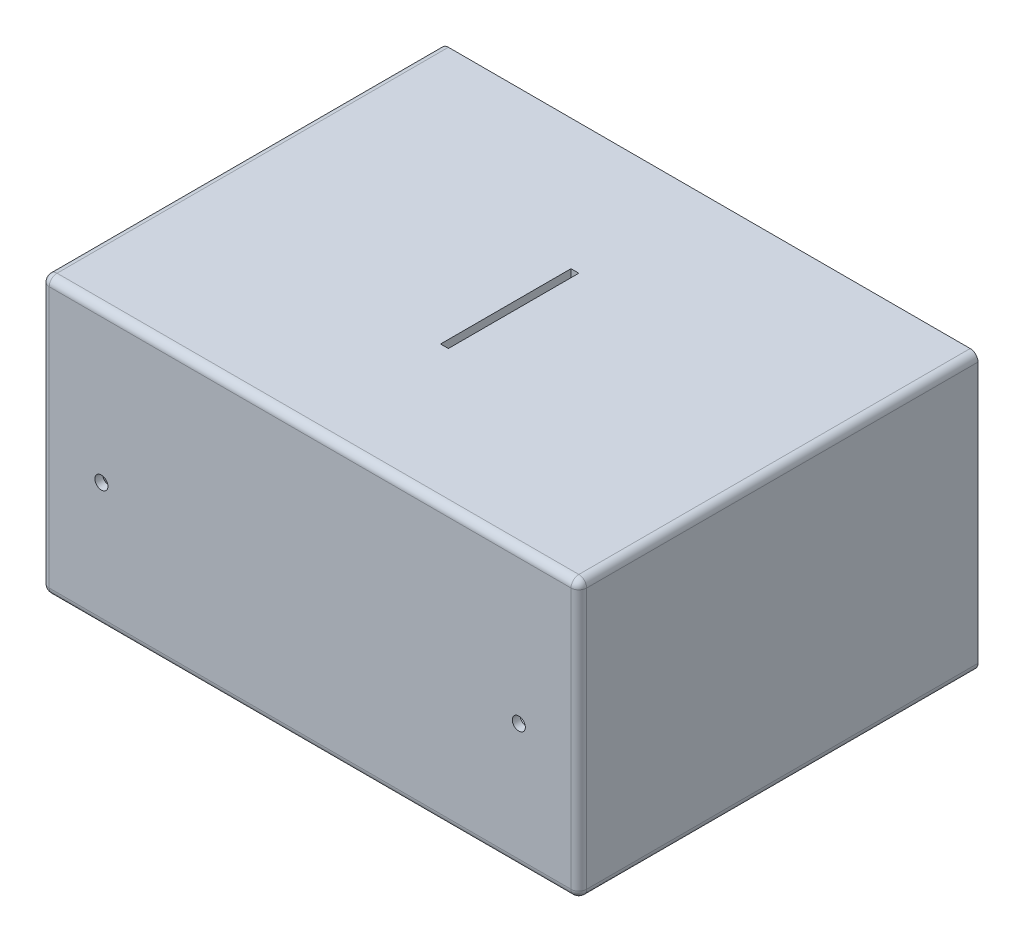
ISO-10303-21;
HEADER;
FILE_DESCRIPTION(('STEP AP214'),'2;1');
FILE_NAME('part.step','',(''),(''),'','','');
FILE_SCHEMA(('AUTOMOTIVE_DESIGN { 1 0 10303 214 1 1 1 1 }'));
ENDSEC;
DATA;
#1=APPLICATION_CONTEXT('core data for automotive mechanical design processes');
#2=APPLICATION_PROTOCOL_DEFINITION('international standard','automotive_design',2000,#1);
#3=PRODUCT_CONTEXT('',#1,'mechanical');
#4=PRODUCT('Part','Part','',(#3));
#5=PRODUCT_RELATED_PRODUCT_CATEGORY('part','',(#4));
#6=PRODUCT_DEFINITION_FORMATION('','',#4);
#7=PRODUCT_DEFINITION_CONTEXT('part definition',#1,'design');
#8=PRODUCT_DEFINITION('design','',#6,#7);
#9=PRODUCT_DEFINITION_SHAPE('','',#8);
#10=(LENGTH_UNIT() NAMED_UNIT(*) SI_UNIT(.MILLI.,.METRE.));
#11=(NAMED_UNIT(*) PLANE_ANGLE_UNIT() SI_UNIT($,.RADIAN.));
#12=(NAMED_UNIT(*) SI_UNIT($,.STERADIAN.) SOLID_ANGLE_UNIT());
#13=UNCERTAINTY_MEASURE_WITH_UNIT(LENGTH_MEASURE(1.E-05),#10,'distance_accuracy_value','');
#14=(GEOMETRIC_REPRESENTATION_CONTEXT(3) GLOBAL_UNCERTAINTY_ASSIGNED_CONTEXT((#13)) GLOBAL_UNIT_ASSIGNED_CONTEXT((#10,
#11,#12)) REPRESENTATION_CONTEXT('',''));
#15=CARTESIAN_POINT('',(0.,0.,0.));
#16=DIRECTION('',(0.,0.,1.));
#17=DIRECTION('',(1.,0.,0.));
#18=AXIS2_PLACEMENT_3D('',#15,#16,#17);
#19=CARTESIAN_POINT('',(100.,0.,78.));
#20=DIRECTION('',(0.,0.,-1.));
#21=DIRECTION('',(0.,-1.,0.));
#22=AXIS2_PLACEMENT_3D('',#19,#20,#21);
#23=PLANE('',#22);
#24=CARTESIAN_POINT('',(-80.,-55.,78.));
#25=DIRECTION('',(0.,0.,-1.));
#26=DIRECTION('',(1.,0.,0.));
#27=AXIS2_PLACEMENT_3D('',#24,#25,#26);
#28=CIRCLE('',#27,2.5);
#29=CARTESIAN_POINT('',(-77.5,-55.,78.));
#30=VERTEX_POINT('',#29);
#31=EDGE_CURVE('E211',#30,#30,#28,.T.);
#32=ORIENTED_EDGE('',*,*,#31,.T.);
#33=EDGE_LOOP('',(#32));
#34=FACE_BOUND('',#33,.T.);
#35=CARTESIAN_POINT('',(80.,-55.,78.));
#36=DIRECTION('',(0.,0.,-1.));
#37=DIRECTION('',(1.,0.,0.));
#38=AXIS2_PLACEMENT_3D('',#35,#36,#37);
#39=CIRCLE('',#38,2.5);
#40=CARTESIAN_POINT('',(82.5,-55.,78.));
#41=VERTEX_POINT('',#40);
#42=EDGE_CURVE('E252',#41,#41,#39,.T.);
#43=ORIENTED_EDGE('',*,*,#42,.T.);
#44=EDGE_LOOP('',(#43));
#45=FACE_BOUND('',#44,.T.);
#46=DIRECTION('',(-1.,0.,0.));
#47=VECTOR('',#46,1.);
#48=CARTESIAN_POINT('',(100.,0.,78.));
#49=LINE('',#48,#47);
#50=CARTESIAN_POINT('',(100.,0.,78.));
#51=VERTEX_POINT('',#50);
#52=CARTESIAN_POINT('',(-100.,0.,78.));
#53=VERTEX_POINT('',#52);
#54=EDGE_CURVE('E284',#51,#53,#49,.T.);
#55=ORIENTED_EDGE('',*,*,#54,.T.);
#56=DIRECTION('',(0.,-1.,0.));
#57=VECTOR('',#56,1.);
#58=CARTESIAN_POINT('',(-100.,0.,78.));
#59=LINE('',#58,#57);
#60=CARTESIAN_POINT('',(-100.,-100.,78.));
#61=VERTEX_POINT('',#60);
#62=EDGE_CURVE('E44',#53,#61,#59,.T.);
#63=ORIENTED_EDGE('',*,*,#62,.T.);
#64=DIRECTION('',(-1.,0.,0.));
#65=VECTOR('',#64,1.);
#66=CARTESIAN_POINT('',(100.,-100.,78.));
#67=LINE('',#66,#65);
#68=CARTESIAN_POINT('',(100.,-100.,78.));
#69=VERTEX_POINT('',#68);
#70=EDGE_CURVE('E10',#69,#61,#67,.T.);
#71=ORIENTED_EDGE('',*,*,#70,.F.);
#72=DIRECTION('',(0.,-1.,0.));
#73=VECTOR('',#72,1.);
#74=CARTESIAN_POINT('',(100.,0.,78.));
#75=LINE('',#74,#73);
#76=EDGE_CURVE('E280',#51,#69,#75,.T.);
#77=ORIENTED_EDGE('',*,*,#76,.F.);
#78=EDGE_LOOP('',(#55,#63,#71,#77));
#79=FACE_BOUND('',#78,.T.);
#80=ADVANCED_FACE('F16',(#34,#45,#79),#23,.F.);
#81=CARTESIAN_POINT('',(100.,-100.,75.));
#82=DIRECTION('',(-1.,0.,0.));
#83=DIRECTION('',(0.,1.,0.));
#84=AXIS2_PLACEMENT_3D('',#81,#82,#83);
#85=CYLINDRICAL_SURFACE('',#84,3.);
#86=CARTESIAN_POINT('',(-100.,-100.,75.));
#87=DIRECTION('',(1.,0.,0.));
#88=DIRECTION('',(0.,1.,0.));
#89=AXIS2_PLACEMENT_3D('',#86,#87,#88);
#90=CIRCLE('',#89,3.);
#91=CARTESIAN_POINT('',(-100.,-103.,75.));
#92=VERTEX_POINT('',#91);
#93=EDGE_CURVE('E24',#61,#92,#90,.T.);
#94=ORIENTED_EDGE('',*,*,#93,.T.);
#95=DIRECTION('',(-1.,0.,0.));
#96=VECTOR('',#95,1.);
#97=CARTESIAN_POINT('',(100.,-103.,75.));
#98=LINE('',#97,#96);
#99=CARTESIAN_POINT('',(100.,-103.,75.));
#100=VERTEX_POINT('',#99);
#101=EDGE_CURVE('E253',#100,#92,#98,.T.);
#102=ORIENTED_EDGE('',*,*,#101,.F.);
#103=CARTESIAN_POINT('',(100.,-100.,75.));
#104=DIRECTION('',(1.,0.,0.));
#105=DIRECTION('',(0.,1.,0.));
#106=AXIS2_PLACEMENT_3D('',#103,#104,#105);
#107=CIRCLE('',#106,3.);
#108=EDGE_CURVE('E273',#69,#100,#107,.T.);
#109=ORIENTED_EDGE('',*,*,#108,.F.);
#110=ORIENTED_EDGE('',*,*,#70,.T.);
#111=EDGE_LOOP('',(#94,#102,#109,#110));
#112=FACE_BOUND('',#111,.T.);
#113=ADVANCED_FACE('F500',(#112),#85,.T.);
#114=CARTESIAN_POINT('',(-100.,-100.,75.));
#115=DIRECTION('',(-0.707106781186548,0.707106781186548,0.));
#116=DIRECTION('',(0.577350269189626,0.577350269189626,-0.577350269189626));
#117=AXIS2_PLACEMENT_3D('',#114,#115,#116);
#118=SPHERICAL_SURFACE('',#117,3.);
#119=CARTESIAN_POINT('',(-100.,-100.,75.));
#120=DIRECTION('',(0.,-1.,0.));
#121=DIRECTION('',(1.,0.,0.));
#122=AXIS2_PLACEMENT_3D('',#119,#120,#121);
#123=CIRCLE('',#122,3.);
#124=CARTESIAN_POINT('',(-103.,-100.,75.));
#125=VERTEX_POINT('',#124);
#126=EDGE_CURVE('E293',#61,#125,#123,.T.);
#127=ORIENTED_EDGE('',*,*,#126,.T.);
#128=CARTESIAN_POINT('',(-100.,-100.,75.));
#129=DIRECTION('',(0.,0.,1.));
#130=DIRECTION('',(0.,1.,0.));
#131=AXIS2_PLACEMENT_3D('',#128,#129,#130);
#132=CIRCLE('',#131,3.);
#133=EDGE_CURVE('E248',#125,#92,#132,.T.);
#134=ORIENTED_EDGE('',*,*,#133,.T.);
#135=ORIENTED_EDGE('',*,*,#93,.F.);
#136=EDGE_LOOP('',(#127,#134,#135));
#137=FACE_BOUND('',#136,.T.);
#138=ADVANCED_FACE('F502',(#137),#118,.T.);
#139=CARTESIAN_POINT('',(-100.,0.,75.));
#140=DIRECTION('',(0.,-1.,0.));
#141=DIRECTION('',(1.,0.,0.));
#142=AXIS2_PLACEMENT_3D('',#139,#140,#141);
#143=CYLINDRICAL_SURFACE('',#142,3.);
#144=ORIENTED_EDGE('',*,*,#62,.F.);
#145=CARTESIAN_POINT('',(-100.,0.,75.));
#146=DIRECTION('',(0.,-1.,0.));
#147=DIRECTION('',(1.,0.,0.));
#148=AXIS2_PLACEMENT_3D('',#145,#146,#147);
#149=CIRCLE('',#148,3.);
#150=CARTESIAN_POINT('',(-103.,0.,75.));
#151=VERTEX_POINT('',#150);
#152=EDGE_CURVE('E291',#53,#151,#149,.T.);
#153=ORIENTED_EDGE('',*,*,#152,.T.);
#154=DIRECTION('',(0.,-1.,0.));
#155=VECTOR('',#154,1.);
#156=CARTESIAN_POINT('',(-103.,0.,75.));
#157=LINE('',#156,#155);
#158=EDGE_CURVE('E241',#151,#125,#157,.T.);
#159=ORIENTED_EDGE('',*,*,#158,.T.);
#160=ORIENTED_EDGE('',*,*,#126,.F.);
#161=EDGE_LOOP('',(#144,#153,#159,#160));
#162=FACE_BOUND('',#161,.T.);
#163=ADVANCED_FACE('F503',(#162),#143,.T.);
#164=CARTESIAN_POINT('',(-100.,0.,75.));
#165=DIRECTION('',(0.707106781186548,0.707106781186548,0.));
#166=DIRECTION('',(0.577350269189626,-0.577350269189626,-0.577350269189626));
#167=AXIS2_PLACEMENT_3D('',#164,#165,#166);
#168=SPHERICAL_SURFACE('',#167,3.);
#169=ORIENTED_EDGE('',*,*,#152,.F.);
#170=CARTESIAN_POINT('',(-100.,0.,75.));
#171=DIRECTION('',(-1.,0.,0.));
#172=DIRECTION('',(0.,-1.,0.));
#173=AXIS2_PLACEMENT_3D('',#170,#171,#172);
#174=CIRCLE('',#173,3.);
#175=CARTESIAN_POINT('',(-100.,3.,75.));
#176=VERTEX_POINT('',#175);
#177=EDGE_CURVE('E288',#53,#176,#174,.T.);
#178=ORIENTED_EDGE('',*,*,#177,.T.);
#179=CARTESIAN_POINT('',(-100.,0.,75.));
#180=DIRECTION('',(0.,0.,-1.));
#181=DIRECTION('',(0.,-1.,0.));
#182=AXIS2_PLACEMENT_3D('',#179,#180,#181);
#183=CIRCLE('',#182,3.);
#184=EDGE_CURVE('E235',#151,#176,#183,.T.);
#185=ORIENTED_EDGE('',*,*,#184,.F.);
#186=EDGE_LOOP('',(#169,#178,#185));
#187=FACE_BOUND('',#186,.T.);
#188=ADVANCED_FACE('F439',(#187),#168,.T.);
#189=CARTESIAN_POINT('',(100.,0.,75.));
#190=DIRECTION('',(-1.,0.,0.));
#191=DIRECTION('',(0.,-1.,0.));
#192=AXIS2_PLACEMENT_3D('',#189,#190,#191);
#193=CYLINDRICAL_SURFACE('',#192,3.);
#194=ORIENTED_EDGE('',*,*,#54,.F.);
#195=CARTESIAN_POINT('',(100.,0.,75.));
#196=DIRECTION('',(-1.,0.,0.));
#197=DIRECTION('',(0.,-1.,0.));
#198=AXIS2_PLACEMENT_3D('',#195,#196,#197);
#199=CIRCLE('',#198,3.);
#200=CARTESIAN_POINT('',(100.,3.,75.));
#201=VERTEX_POINT('',#200);
#202=EDGE_CURVE('E281',#51,#201,#199,.T.);
#203=ORIENTED_EDGE('',*,*,#202,.T.);
#204=DIRECTION('',(-1.,0.,0.));
#205=VECTOR('',#204,1.);
#206=CARTESIAN_POINT('',(100.,3.,75.));
#207=LINE('',#206,#205);
#208=EDGE_CURVE('E402',#201,#176,#207,.T.);
#209=ORIENTED_EDGE('',*,*,#208,.T.);
#210=ORIENTED_EDGE('',*,*,#177,.F.);
#211=EDGE_LOOP('',(#194,#203,#209,#210));
#212=FACE_BOUND('',#211,.T.);
#213=ADVANCED_FACE('F429',(#212),#193,.T.);
#214=CARTESIAN_POINT('',(100.,0.,75.));
#215=DIRECTION('',(0.,0.707106781186548,-0.707106781186548));
#216=DIRECTION('',(-0.577350269189626,-0.577350269189626,-0.577350269189626));
#217=AXIS2_PLACEMENT_3D('',#214,#215,#216);
#218=SPHERICAL_SURFACE('',#217,3.);
#219=CARTESIAN_POINT('',(100.,0.,75.));
#220=DIRECTION('',(0.,-1.,0.));
#221=DIRECTION('',(0.,0.,-1.));
#222=AXIS2_PLACEMENT_3D('',#219,#220,#221);
#223=CIRCLE('',#222,3.);
#224=CARTESIAN_POINT('',(103.,0.,75.));
#225=VERTEX_POINT('',#224);
#226=EDGE_CURVE('E276',#225,#51,#223,.T.);
#227=ORIENTED_EDGE('',*,*,#226,.F.);
#228=CARTESIAN_POINT('',(100.,0.,75.));
#229=DIRECTION('',(0.,0.,1.));
#230=DIRECTION('',(0.,-1.,0.));
#231=AXIS2_PLACEMENT_3D('',#228,#229,#230);
#232=CIRCLE('',#231,3.);
#233=EDGE_CURVE('E414',#225,#201,#232,.T.);
#234=ORIENTED_EDGE('',*,*,#233,.T.);
#235=ORIENTED_EDGE('',*,*,#202,.F.);
#236=EDGE_LOOP('',(#227,#234,#235));
#237=FACE_BOUND('',#236,.T.);
#238=ADVANCED_FACE('F508',(#237),#218,.T.);
#239=CARTESIAN_POINT('',(100.,0.,75.));
#240=DIRECTION('',(0.,-1.,0.));
#241=DIRECTION('',(0.,0.,-1.));
#242=AXIS2_PLACEMENT_3D('',#239,#240,#241);
#243=CYLINDRICAL_SURFACE('',#242,3.);
#244=DIRECTION('',(0.,-1.,0.));
#245=VECTOR('',#244,1.);
#246=CARTESIAN_POINT('',(103.,0.,75.));
#247=LINE('',#246,#245);
#248=CARTESIAN_POINT('',(103.,-100.,75.));
#249=VERTEX_POINT('',#248);
#250=EDGE_CURVE('E317',#225,#249,#247,.T.);
#251=ORIENTED_EDGE('',*,*,#250,.F.);
#252=ORIENTED_EDGE('',*,*,#226,.T.);
#253=ORIENTED_EDGE('',*,*,#76,.T.);
#254=CARTESIAN_POINT('',(100.,-100.,75.));
#255=DIRECTION('',(0.,-1.,0.));
#256=DIRECTION('',(0.,0.,-1.));
#257=AXIS2_PLACEMENT_3D('',#254,#255,#256);
#258=CIRCLE('',#257,3.);
#259=EDGE_CURVE('E272',#249,#69,#258,.T.);
#260=ORIENTED_EDGE('',*,*,#259,.F.);
#261=EDGE_LOOP('',(#251,#252,#253,#260));
#262=FACE_BOUND('',#261,.T.);
#263=ADVANCED_FACE('F714',(#262),#243,.T.);
#264=CARTESIAN_POINT('',(100.,-100.,75.));
#265=DIRECTION('',(0.,0.707106781186548,0.707106781186548));
#266=DIRECTION('',(-0.577350269189626,0.577350269189626,-0.577350269189626));
#267=AXIS2_PLACEMENT_3D('',#264,#265,#266);
#268=SPHERICAL_SURFACE('',#267,3.);
#269=ORIENTED_EDGE('',*,*,#259,.T.);
#270=ORIENTED_EDGE('',*,*,#108,.T.);
#271=CARTESIAN_POINT('',(100.,-100.,75.));
#272=DIRECTION('',(0.,0.,-1.));
#273=DIRECTION('',(0.,1.,0.));
#274=AXIS2_PLACEMENT_3D('',#271,#272,#273);
#275=CIRCLE('',#274,3.);
#276=EDGE_CURVE('E354',#249,#100,#275,.T.);
#277=ORIENTED_EDGE('',*,*,#276,.F.);
#278=EDGE_LOOP('',(#269,#270,#277));
#279=FACE_BOUND('',#278,.T.);
#280=ADVANCED_FACE('F499',(#279),#268,.T.);
#281=CARTESIAN_POINT('',(-3.,0.,0.));
#282=DIRECTION('',(1.,0.,0.));
#283=DIRECTION('',(0.,1.,0.));
#284=AXIS2_PLACEMENT_3D('',#281,#282,#283);
#285=PLANE('',#284);
#286=DIRECTION('',(0.,0.,1.));
#287=VECTOR('',#286,1.);
#288=CARTESIAN_POINT('',(-3.,0.,0.));
#289=LINE('',#288,#287);
#290=CARTESIAN_POINT('',(-3.,0.,-25.));
#291=VERTEX_POINT('',#290);
#292=CARTESIAN_POINT('',(-3.,0.,25.));
#293=VERTEX_POINT('',#292);
#294=EDGE_CURVE('E205',#291,#293,#289,.T.);
#295=ORIENTED_EDGE('',*,*,#294,.F.);
#296=DIRECTION('',(0.,1.,0.));
#297=VECTOR('',#296,1.);
#298=CARTESIAN_POINT('',(-3.,-40.,-25.));
#299=LINE('',#298,#297);
#300=CARTESIAN_POINT('',(-3.,3.,-25.));
#301=VERTEX_POINT('',#300);
#302=EDGE_CURVE('E198',#291,#301,#299,.T.);
#303=ORIENTED_EDGE('',*,*,#302,.T.);
#304=DIRECTION('',(0.,0.,1.));
#305=VECTOR('',#304,1.);
#306=CARTESIAN_POINT('',(-3.,3.,0.));
#307=LINE('',#306,#305);
#308=CARTESIAN_POINT('',(-3.,3.,25.));
#309=VERTEX_POINT('',#308);
#310=EDGE_CURVE('E202',#301,#309,#307,.T.);
#311=ORIENTED_EDGE('',*,*,#310,.T.);
#312=DIRECTION('',(0.,-1.,0.));
#313=VECTOR('',#312,1.);
#314=CARTESIAN_POINT('',(-3.,40.,25.));
#315=LINE('',#314,#313);
#316=EDGE_CURVE('E269',#309,#293,#315,.T.);
#317=ORIENTED_EDGE('',*,*,#316,.T.);
#318=EDGE_LOOP('',(#295,#303,#311,#317));
#319=FACE_BOUND('',#318,.T.);
#320=ADVANCED_FACE('F200',(#319),#285,.T.);
#321=CARTESIAN_POINT('',(0.,40.,25.));
#322=DIRECTION('',(0.,0.,1.));
#323=DIRECTION('',(1.,0.,0.));
#324=AXIS2_PLACEMENT_3D('',#321,#322,#323);
#325=PLANE('',#324);
#326=DIRECTION('',(-1.,0.,0.));
#327=VECTOR('',#326,1.);
#328=CARTESIAN_POINT('',(0.,0.,25.));
#329=LINE('',#328,#327);
#330=CARTESIAN_POINT('',(0.,0.,25.));
#331=VERTEX_POINT('',#330);
#332=EDGE_CURVE('E390',#331,#293,#329,.T.);
#333=ORIENTED_EDGE('',*,*,#332,.T.);
#334=ORIENTED_EDGE('',*,*,#316,.F.);
#335=DIRECTION('',(-1.,0.,0.));
#336=VECTOR('',#335,1.);
#337=CARTESIAN_POINT('',(0.,3.,25.));
#338=LINE('',#337,#336);
#339=CARTESIAN_POINT('',(0.,3.,25.));
#340=VERTEX_POINT('',#339);
#341=EDGE_CURVE('E225',#340,#309,#338,.T.);
#342=ORIENTED_EDGE('',*,*,#341,.F.);
#343=DIRECTION('',(0.,-1.,0.));
#344=VECTOR('',#343,1.);
#345=CARTESIAN_POINT('',(0.,40.,25.));
#346=LINE('',#345,#344);
#347=EDGE_CURVE('E266',#340,#331,#346,.T.);
#348=ORIENTED_EDGE('',*,*,#347,.T.);
#349=EDGE_LOOP('',(#333,#334,#342,#348));
#350=FACE_BOUND('',#349,.T.);
#351=ADVANCED_FACE('F688',(#350),#325,.F.);
#352=CARTESIAN_POINT('',(0.,0.,0.));
#353=DIRECTION('',(1.,0.,0.));
#354=DIRECTION('',(0.,1.,0.));
#355=AXIS2_PLACEMENT_3D('',#352,#353,#354);
#356=PLANE('',#355);
#357=ORIENTED_EDGE('',*,*,#347,.F.);
#358=DIRECTION('',(0.,0.,1.));
#359=VECTOR('',#358,1.);
#360=CARTESIAN_POINT('',(0.,3.,0.));
#361=LINE('',#360,#359);
#362=CARTESIAN_POINT('',(0.,3.,-25.));
#363=VERTEX_POINT('',#362);
#364=EDGE_CURVE('E231',#363,#340,#361,.T.);
#365=ORIENTED_EDGE('',*,*,#364,.F.);
#366=DIRECTION('',(0.,1.,0.));
#367=VECTOR('',#366,1.);
#368=CARTESIAN_POINT('',(0.,-40.,-25.));
#369=LINE('',#368,#367);
#370=CARTESIAN_POINT('',(0.,0.,-25.));
#371=VERTEX_POINT('',#370);
#372=EDGE_CURVE('E210',#371,#363,#369,.T.);
#373=ORIENTED_EDGE('',*,*,#372,.F.);
#374=DIRECTION('',(0.,0.,1.));
#375=VECTOR('',#374,1.);
#376=CARTESIAN_POINT('',(0.,0.,0.));
#377=LINE('',#376,#375);
#378=EDGE_CURVE('E394',#371,#331,#377,.T.);
#379=ORIENTED_EDGE('',*,*,#378,.T.);
#380=EDGE_LOOP('',(#357,#365,#373,#379));
#381=FACE_BOUND('',#380,.T.);
#382=ADVANCED_FACE('F679',(#381),#356,.F.);
#383=CARTESIAN_POINT('',(0.,-40.,-25.));
#384=DIRECTION('',(0.,0.,-1.));
#385=DIRECTION('',(0.,-1.,0.));
#386=AXIS2_PLACEMENT_3D('',#383,#384,#385);
#387=PLANE('',#386);
#388=DIRECTION('',(1.,0.,0.));
#389=VECTOR('',#388,1.);
#390=CARTESIAN_POINT('',(0.,3.,-25.));
#391=LINE('',#390,#389);
#392=EDGE_CURVE('E214',#301,#363,#391,.T.);
#393=ORIENTED_EDGE('',*,*,#392,.F.);
#394=ORIENTED_EDGE('',*,*,#302,.F.);
#395=DIRECTION('',(1.,0.,0.));
#396=VECTOR('',#395,1.);
#397=CARTESIAN_POINT('',(0.,0.,-25.));
#398=LINE('',#397,#396);
#399=EDGE_CURVE('E385',#291,#371,#398,.T.);
#400=ORIENTED_EDGE('',*,*,#399,.T.);
#401=ORIENTED_EDGE('',*,*,#372,.T.);
#402=EDGE_LOOP('',(#393,#394,#400,#401));
#403=FACE_BOUND('',#402,.T.);
#404=ADVANCED_FACE('F215',(#403),#387,.F.);
#405=CARTESIAN_POINT('',(-80.,-55.,0.));
#406=DIRECTION('',(0.,0.,-1.));
#407=DIRECTION('',(1.,0.,0.));
#408=AXIS2_PLACEMENT_3D('',#405,#406,#407);
#409=CYLINDRICAL_SURFACE('',#408,2.5);
#410=CARTESIAN_POINT('',(-80.,-55.,75.));
#411=DIRECTION('',(0.,0.,-1.));
#412=DIRECTION('',(1.,0.,0.));
#413=AXIS2_PLACEMENT_3D('',#410,#411,#412);
#414=CIRCLE('',#413,2.5);
#415=CARTESIAN_POINT('',(-77.5,-55.,75.));
#416=VERTEX_POINT('',#415);
#417=EDGE_CURVE('E319',#416,#416,#414,.T.);
#418=ORIENTED_EDGE('',*,*,#417,.T.);
#419=DIRECTION('',(0.,0.,1.));
#420=VECTOR('',#419,1.);
#421=CARTESIAN_POINT('',(-77.5,-55.,0.));
#422=LINE('',#421,#420);
#423=EDGE_CURVE('E244',#416,#30,#422,.T.);
#424=ORIENTED_EDGE('',*,*,#423,.T.);
#425=ORIENTED_EDGE('',*,*,#31,.F.);
#426=ORIENTED_EDGE('',*,*,#423,.F.);
#427=EDGE_LOOP('',(#418,#424,#425,#426));
#428=FACE_BOUND('',#427,.T.);
#429=ADVANCED_FACE('F560',(#428),#409,.F.);
#430=CARTESIAN_POINT('',(80.,-55.,0.));
#431=DIRECTION('',(0.,0.,-1.));
#432=DIRECTION('',(1.,0.,0.));
#433=AXIS2_PLACEMENT_3D('',#430,#431,#432);
#434=CYLINDRICAL_SURFACE('',#433,2.5);
#435=CARTESIAN_POINT('',(80.,-55.,75.));
#436=DIRECTION('',(0.,0.,-1.));
#437=DIRECTION('',(1.,0.,0.));
#438=AXIS2_PLACEMENT_3D('',#435,#436,#437);
#439=CIRCLE('',#438,2.5);
#440=CARTESIAN_POINT('',(82.5,-55.,75.));
#441=VERTEX_POINT('',#440);
#442=EDGE_CURVE('E324',#441,#441,#439,.T.);
#443=ORIENTED_EDGE('',*,*,#442,.T.);
#444=DIRECTION('',(0.,0.,1.));
#445=VECTOR('',#444,1.);
#446=CARTESIAN_POINT('',(82.5,-55.,0.));
#447=LINE('',#446,#445);
#448=EDGE_CURVE('E257',#441,#41,#447,.T.);
#449=ORIENTED_EDGE('',*,*,#448,.T.);
#450=ORIENTED_EDGE('',*,*,#42,.F.);
#451=ORIENTED_EDGE('',*,*,#448,.F.);
#452=EDGE_LOOP('',(#443,#449,#450,#451));
#453=FACE_BOUND('',#452,.T.);
#454=ADVANCED_FACE('F535',(#453),#434,.F.);
#455=CARTESIAN_POINT('',(0.,-103.,0.));
#456=DIRECTION('',(0.,-1.,0.));
#457=DIRECTION('',(0.,0.,-1.));
#458=AXIS2_PLACEMENT_3D('',#455,#456,#457);
#459=PLANE('',#458);
#460=DIRECTION('',(1.,0.,0.));
#461=VECTOR('',#460,1.);
#462=CARTESIAN_POINT('',(-100.,-103.,-75.));
#463=LINE('',#462,#461);
#464=CARTESIAN_POINT('',(-100.,-103.,-75.));
#465=VERTEX_POINT('',#464);
#466=CARTESIAN_POINT('',(100.,-103.,-75.));
#467=VERTEX_POINT('',#466);
#468=EDGE_CURVE('E307',#465,#467,#463,.T.);
#469=ORIENTED_EDGE('',*,*,#468,.T.);
#470=DIRECTION('',(0.,0.,1.));
#471=VECTOR('',#470,1.);
#472=CARTESIAN_POINT('',(100.,-103.,-75.));
#473=LINE('',#472,#471);
#474=EDGE_CURVE('E318',#467,#100,#473,.T.);
#475=ORIENTED_EDGE('',*,*,#474,.T.);
#476=ORIENTED_EDGE('',*,*,#101,.T.);
#477=DIRECTION('',(0.,0.,-1.));
#478=VECTOR('',#477,1.);
#479=CARTESIAN_POINT('',(-100.,-103.,75.));
#480=LINE('',#479,#478);
#481=EDGE_CURVE('E258',#92,#465,#480,.T.);
#482=ORIENTED_EDGE('',*,*,#481,.T.);
#483=EDGE_LOOP('',(#469,#475,#476,#482));
#484=FACE_BOUND('',#483,.T.);
#485=ADVANCED_FACE('F490',(#484),#459,.T.);
#486=CARTESIAN_POINT('',(-100.,-100.,75.));
#487=DIRECTION('',(0.,0.,-1.));
#488=DIRECTION('',(0.,1.,0.));
#489=AXIS2_PLACEMENT_3D('',#486,#487,#488);
#490=CYLINDRICAL_SURFACE('',#489,3.);
#491=ORIENTED_EDGE('',*,*,#133,.F.);
#492=DIRECTION('',(0.,0.,-1.));
#493=VECTOR('',#492,1.);
#494=CARTESIAN_POINT('',(-103.,-100.,75.));
#495=LINE('',#494,#493);
#496=CARTESIAN_POINT('',(-103.,-100.,-75.));
#497=VERTEX_POINT('',#496);
#498=EDGE_CURVE('E238',#125,#497,#495,.T.);
#499=ORIENTED_EDGE('',*,*,#498,.T.);
#500=CARTESIAN_POINT('',(-100.,-100.,-75.));
#501=DIRECTION('',(0.,0.,1.));
#502=DIRECTION('',(0.,1.,0.));
#503=AXIS2_PLACEMENT_3D('',#500,#501,#502);
#504=CIRCLE('',#503,3.);
#505=EDGE_CURVE('E330',#497,#465,#504,.T.);
#506=ORIENTED_EDGE('',*,*,#505,.T.);
#507=ORIENTED_EDGE('',*,*,#481,.F.);
#508=EDGE_LOOP('',(#491,#499,#506,#507));
#509=FACE_BOUND('',#508,.T.);
#510=ADVANCED_FACE('F501',(#509),#490,.T.);
#511=CARTESIAN_POINT('',(-103.,0.,75.));
#512=DIRECTION('',(1.,0.,0.));
#513=DIRECTION('',(0.,1.,0.));
#514=AXIS2_PLACEMENT_3D('',#511,#512,#513);
#515=PLANE('',#514);
#516=DIRECTION('',(0.,0.,-1.));
#517=VECTOR('',#516,1.);
#518=CARTESIAN_POINT('',(-103.,0.,75.));
#519=LINE('',#518,#517);
#520=CARTESIAN_POINT('',(-103.,0.,-75.));
#521=VERTEX_POINT('',#520);
#522=EDGE_CURVE('E220',#151,#521,#519,.T.);
#523=ORIENTED_EDGE('',*,*,#522,.T.);
#524=DIRECTION('',(0.,-1.,0.));
#525=VECTOR('',#524,1.);
#526=CARTESIAN_POINT('',(-103.,0.,-75.));
#527=LINE('',#526,#525);
#528=EDGE_CURVE('E325',#521,#497,#527,.T.);
#529=ORIENTED_EDGE('',*,*,#528,.T.);
#530=ORIENTED_EDGE('',*,*,#498,.F.);
#531=ORIENTED_EDGE('',*,*,#158,.F.);
#532=EDGE_LOOP('',(#523,#529,#530,#531));
#533=FACE_BOUND('',#532,.T.);
#534=ADVANCED_FACE('F514',(#533),#515,.F.);
#535=CARTESIAN_POINT('',(-100.,0.,75.));
#536=DIRECTION('',(0.,0.,-1.));
#537=DIRECTION('',(0.,-1.,0.));
#538=AXIS2_PLACEMENT_3D('',#535,#536,#537);
#539=CYLINDRICAL_SURFACE('',#538,3.);
#540=DIRECTION('',(0.,0.,-1.));
#541=VECTOR('',#540,1.);
#542=CARTESIAN_POINT('',(-100.,3.,75.));
#543=LINE('',#542,#541);
#544=CARTESIAN_POINT('',(-100.,3.,-75.));
#545=VERTEX_POINT('',#544);
#546=EDGE_CURVE('E420',#176,#545,#543,.T.);
#547=ORIENTED_EDGE('',*,*,#546,.T.);
#548=CARTESIAN_POINT('',(-100.,0.,-75.));
#549=DIRECTION('',(0.,0.,-1.));
#550=DIRECTION('',(0.,-1.,0.));
#551=AXIS2_PLACEMENT_3D('',#548,#549,#550);
#552=CIRCLE('',#551,3.);
#553=EDGE_CURVE('E329',#521,#545,#552,.T.);
#554=ORIENTED_EDGE('',*,*,#553,.F.);
#555=ORIENTED_EDGE('',*,*,#522,.F.);
#556=ORIENTED_EDGE('',*,*,#184,.T.);
#557=EDGE_LOOP('',(#547,#554,#555,#556));
#558=FACE_BOUND('',#557,.T.);
#559=ADVANCED_FACE('F434',(#558),#539,.T.);
#560=CARTESIAN_POINT('',(0.,3.,0.));
#561=DIRECTION('',(0.,-1.,0.));
#562=DIRECTION('',(0.,0.,-1.));
#563=AXIS2_PLACEMENT_3D('',#560,#561,#562);
#564=PLANE('',#563);
#565=ORIENTED_EDGE('',*,*,#364,.T.);
#566=ORIENTED_EDGE('',*,*,#341,.T.);
#567=ORIENTED_EDGE('',*,*,#310,.F.);
#568=ORIENTED_EDGE('',*,*,#392,.T.);
#569=EDGE_LOOP('',(#565,#566,#567,#568));
#570=FACE_BOUND('',#569,.T.);
#571=ORIENTED_EDGE('',*,*,#546,.F.);
#572=ORIENTED_EDGE('',*,*,#208,.F.);
#573=DIRECTION('',(0.,0.,1.));
#574=VECTOR('',#573,1.);
#575=CARTESIAN_POINT('',(100.,3.,-75.));
#576=LINE('',#575,#574);
#577=CARTESIAN_POINT('',(100.,3.,-75.));
#578=VERTEX_POINT('',#577);
#579=EDGE_CURVE('E379',#578,#201,#576,.T.);
#580=ORIENTED_EDGE('',*,*,#579,.F.);
#581=DIRECTION('',(1.,0.,0.));
#582=VECTOR('',#581,1.);
#583=CARTESIAN_POINT('',(-100.,3.,-75.));
#584=LINE('',#583,#582);
#585=EDGE_CURVE('E334',#545,#578,#584,.T.);
#586=ORIENTED_EDGE('',*,*,#585,.F.);
#587=EDGE_LOOP('',(#571,#572,#580,#586));
#588=FACE_BOUND('',#587,.T.);
#589=ADVANCED_FACE('F222',(#570,#588),#564,.F.);
#590=CARTESIAN_POINT('',(100.,0.,-75.));
#591=DIRECTION('',(0.,0.,1.));
#592=DIRECTION('',(0.,-1.,0.));
#593=AXIS2_PLACEMENT_3D('',#590,#591,#592);
#594=CYLINDRICAL_SURFACE('',#593,3.);
#595=ORIENTED_EDGE('',*,*,#579,.T.);
#596=ORIENTED_EDGE('',*,*,#233,.F.);
#597=DIRECTION('',(0.,0.,1.));
#598=VECTOR('',#597,1.);
#599=CARTESIAN_POINT('',(103.,0.,-75.));
#600=LINE('',#599,#598);
#601=CARTESIAN_POINT('',(103.,0.,-75.));
#602=VERTEX_POINT('',#601);
#603=EDGE_CURVE('E313',#602,#225,#600,.T.);
#604=ORIENTED_EDGE('',*,*,#603,.F.);
#605=CARTESIAN_POINT('',(100.,0.,-75.));
#606=DIRECTION('',(0.,0.,1.));
#607=DIRECTION('',(0.,-1.,0.));
#608=AXIS2_PLACEMENT_3D('',#605,#606,#607);
#609=CIRCLE('',#608,3.);
#610=EDGE_CURVE('E335',#602,#578,#609,.T.);
#611=ORIENTED_EDGE('',*,*,#610,.T.);
#612=EDGE_LOOP('',(#595,#596,#604,#611));
#613=FACE_BOUND('',#612,.T.);
#614=ADVANCED_FACE('F512',(#613),#594,.T.);
#615=CARTESIAN_POINT('',(103.,0.,-75.));
#616=DIRECTION('',(-1.,0.,0.));
#617=DIRECTION('',(0.,0.,1.));
#618=AXIS2_PLACEMENT_3D('',#615,#616,#617);
#619=PLANE('',#618);
#620=ORIENTED_EDGE('',*,*,#603,.T.);
#621=ORIENTED_EDGE('',*,*,#250,.T.);
#622=DIRECTION('',(0.,0.,1.));
#623=VECTOR('',#622,1.);
#624=CARTESIAN_POINT('',(103.,-100.,-75.));
#625=LINE('',#624,#623);
#626=CARTESIAN_POINT('',(103.,-100.,-75.));
#627=VERTEX_POINT('',#626);
#628=EDGE_CURVE('E350',#627,#249,#625,.T.);
#629=ORIENTED_EDGE('',*,*,#628,.F.);
#630=DIRECTION('',(0.,-1.,0.));
#631=VECTOR('',#630,1.);
#632=CARTESIAN_POINT('',(103.,0.,-75.));
#633=LINE('',#632,#631);
#634=EDGE_CURVE('E339',#602,#627,#633,.T.);
#635=ORIENTED_EDGE('',*,*,#634,.F.);
#636=EDGE_LOOP('',(#620,#621,#629,#635));
#637=FACE_BOUND('',#636,.T.);
#638=ADVANCED_FACE('F554',(#637),#619,.F.);
#639=CARTESIAN_POINT('',(100.,-100.,-75.));
#640=DIRECTION('',(0.,0.,1.));
#641=DIRECTION('',(0.,1.,0.));
#642=AXIS2_PLACEMENT_3D('',#639,#640,#641);
#643=CYLINDRICAL_SURFACE('',#642,3.);
#644=CARTESIAN_POINT('',(100.,-100.,-75.));
#645=DIRECTION('',(0.,0.,-1.));
#646=DIRECTION('',(0.,1.,0.));
#647=AXIS2_PLACEMENT_3D('',#644,#645,#646);
#648=CIRCLE('',#647,3.);
#649=EDGE_CURVE('E346',#627,#467,#648,.T.);
#650=ORIENTED_EDGE('',*,*,#649,.F.);
#651=ORIENTED_EDGE('',*,*,#628,.T.);
#652=ORIENTED_EDGE('',*,*,#276,.T.);
#653=ORIENTED_EDGE('',*,*,#474,.F.);
#654=EDGE_LOOP('',(#650,#651,#652,#653));
#655=FACE_BOUND('',#654,.T.);
#656=ADVANCED_FACE('F496',(#655),#643,.T.);
#657=CARTESIAN_POINT('',(-100.,0.,75.));
#658=DIRECTION('',(1.,0.,0.));
#659=DIRECTION('',(0.,1.,0.));
#660=AXIS2_PLACEMENT_3D('',#657,#658,#659);
#661=PLANE('',#660);
#662=DIRECTION('',(0.,-1.,0.));
#663=VECTOR('',#662,1.);
#664=CARTESIAN_POINT('',(-100.,0.,75.));
#665=LINE('',#664,#663);
#666=CARTESIAN_POINT('',(-100.,0.,75.));
#667=VERTEX_POINT('',#666);
#668=CARTESIAN_POINT('',(-100.,-100.,75.));
#669=VERTEX_POINT('',#668);
#670=EDGE_CURVE('E363',#667,#669,#665,.T.);
#671=ORIENTED_EDGE('',*,*,#670,.T.);
#672=DIRECTION('',(0.,0.,-1.));
#673=VECTOR('',#672,1.);
#674=CARTESIAN_POINT('',(-100.,-100.,75.));
#675=LINE('',#674,#673);
#676=CARTESIAN_POINT('',(-100.,-100.,-75.));
#677=VERTEX_POINT('',#676);
#678=EDGE_CURVE('E355',#669,#677,#675,.T.);
#679=ORIENTED_EDGE('',*,*,#678,.T.);
#680=DIRECTION('',(0.,-1.,0.));
#681=VECTOR('',#680,1.);
#682=CARTESIAN_POINT('',(-100.,0.,-75.));
#683=LINE('',#682,#681);
#684=CARTESIAN_POINT('',(-100.,0.,-75.));
#685=VERTEX_POINT('',#684);
#686=EDGE_CURVE('E309',#685,#677,#683,.T.);
#687=ORIENTED_EDGE('',*,*,#686,.F.);
#688=DIRECTION('',(0.,0.,-1.));
#689=VECTOR('',#688,1.);
#690=CARTESIAN_POINT('',(-100.,0.,75.));
#691=LINE('',#690,#689);
#692=EDGE_CURVE('E323',#667,#685,#691,.T.);
#693=ORIENTED_EDGE('',*,*,#692,.F.);
#694=EDGE_LOOP('',(#671,#679,#687,#693));
#695=FACE_BOUND('',#694,.T.);
#696=ADVANCED_FACE('F547',(#695),#661,.T.);
#697=CARTESIAN_POINT('',(0.,-100.,0.));
#698=DIRECTION('',(0.,-1.,0.));
#699=DIRECTION('',(0.,0.,-1.));
#700=AXIS2_PLACEMENT_3D('',#697,#698,#699);
#701=PLANE('',#700);
#702=ORIENTED_EDGE('',*,*,#678,.F.);
#703=DIRECTION('',(-1.,0.,0.));
#704=VECTOR('',#703,1.);
#705=CARTESIAN_POINT('',(100.,-100.,75.));
#706=LINE('',#705,#704);
#707=CARTESIAN_POINT('',(100.,-100.,75.));
#708=VERTEX_POINT('',#707);
#709=EDGE_CURVE('E359',#708,#669,#706,.T.);
#710=ORIENTED_EDGE('',*,*,#709,.F.);
#711=DIRECTION('',(0.,0.,1.));
#712=VECTOR('',#711,1.);
#713=CARTESIAN_POINT('',(100.,-100.,-75.));
#714=LINE('',#713,#712);
#715=CARTESIAN_POINT('',(100.,-100.,-75.));
#716=VERTEX_POINT('',#715);
#717=EDGE_CURVE('E475',#716,#708,#714,.T.);
#718=ORIENTED_EDGE('',*,*,#717,.F.);
#719=DIRECTION('',(1.,0.,0.));
#720=VECTOR('',#719,1.);
#721=CARTESIAN_POINT('',(-100.,-100.,-75.));
#722=LINE('',#721,#720);
#723=EDGE_CURVE('E453',#677,#716,#722,.T.);
#724=ORIENTED_EDGE('',*,*,#723,.F.);
#725=EDGE_LOOP('',(#702,#710,#718,#724));
#726=FACE_BOUND('',#725,.T.);
#727=ADVANCED_FACE('F545',(#726),#701,.F.);
#728=CARTESIAN_POINT('',(0.,0.,0.));
#729=DIRECTION('',(0.,-1.,0.));
#730=DIRECTION('',(0.,0.,-1.));
#731=AXIS2_PLACEMENT_3D('',#728,#729,#730);
#732=PLANE('',#731);
#733=ORIENTED_EDGE('',*,*,#399,.F.);
#734=ORIENTED_EDGE('',*,*,#294,.T.);
#735=ORIENTED_EDGE('',*,*,#332,.F.);
#736=ORIENTED_EDGE('',*,*,#378,.F.);
#737=EDGE_LOOP('',(#733,#734,#735,#736));
#738=FACE_BOUND('',#737,.T.);
#739=DIRECTION('',(1.,0.,0.));
#740=VECTOR('',#739,1.);
#741=CARTESIAN_POINT('',(-100.,0.,-75.));
#742=LINE('',#741,#740);
#743=CARTESIAN_POINT('',(100.,0.,-75.));
#744=VERTEX_POINT('',#743);
#745=EDGE_CURVE('E312',#685,#744,#742,.T.);
#746=ORIENTED_EDGE('',*,*,#745,.T.);
#747=DIRECTION('',(0.,0.,1.));
#748=VECTOR('',#747,1.);
#749=CARTESIAN_POINT('',(100.,0.,-75.));
#750=LINE('',#749,#748);
#751=CARTESIAN_POINT('',(100.,0.,75.));
#752=VERTEX_POINT('',#751);
#753=EDGE_CURVE('E450',#744,#752,#750,.T.);
#754=ORIENTED_EDGE('',*,*,#753,.T.);
#755=DIRECTION('',(-1.,0.,0.));
#756=VECTOR('',#755,1.);
#757=CARTESIAN_POINT('',(100.,0.,75.));
#758=LINE('',#757,#756);
#759=EDGE_CURVE('E372',#752,#667,#758,.T.);
#760=ORIENTED_EDGE('',*,*,#759,.T.);
#761=ORIENTED_EDGE('',*,*,#692,.T.);
#762=EDGE_LOOP('',(#746,#754,#760,#761));
#763=FACE_BOUND('',#762,.T.);
#764=ADVANCED_FACE('F460',(#738,#763),#732,.T.);
#765=CARTESIAN_POINT('',(100.,0.,75.));
#766=DIRECTION('',(0.,0.,-1.));
#767=DIRECTION('',(0.,-1.,0.));
#768=AXIS2_PLACEMENT_3D('',#765,#766,#767);
#769=PLANE('',#768);
#770=ORIENTED_EDGE('',*,*,#417,.F.);
#771=EDGE_LOOP('',(#770));
#772=FACE_BOUND('',#771,.T.);
#773=ORIENTED_EDGE('',*,*,#442,.F.);
#774=EDGE_LOOP('',(#773));
#775=FACE_BOUND('',#774,.T.);
#776=DIRECTION('',(0.,-1.,0.));
#777=VECTOR('',#776,1.);
#778=CARTESIAN_POINT('',(100.,0.,75.));
#779=LINE('',#778,#777);
#780=EDGE_CURVE('E448',#752,#708,#779,.T.);
#781=ORIENTED_EDGE('',*,*,#780,.T.);
#782=ORIENTED_EDGE('',*,*,#709,.T.);
#783=ORIENTED_EDGE('',*,*,#670,.F.);
#784=ORIENTED_EDGE('',*,*,#759,.F.);
#785=EDGE_LOOP('',(#781,#782,#783,#784));
#786=FACE_BOUND('',#785,.T.);
#787=ADVANCED_FACE('F538',(#772,#775,#786),#769,.T.);
#788=CARTESIAN_POINT('',(-100.,0.,-75.));
#789=DIRECTION('',(0.,0.,1.));
#790=DIRECTION('',(1.,0.,0.));
#791=AXIS2_PLACEMENT_3D('',#788,#789,#790);
#792=PLANE('',#791);
#793=ORIENTED_EDGE('',*,*,#468,.F.);
#794=ORIENTED_EDGE('',*,*,#505,.F.);
#795=ORIENTED_EDGE('',*,*,#528,.F.);
#796=ORIENTED_EDGE('',*,*,#553,.T.);
#797=ORIENTED_EDGE('',*,*,#585,.T.);
#798=ORIENTED_EDGE('',*,*,#610,.F.);
#799=ORIENTED_EDGE('',*,*,#634,.T.);
#800=ORIENTED_EDGE('',*,*,#649,.T.);
#801=EDGE_LOOP('',(#793,#794,#795,#796,#797,#798,#799,#800));
#802=FACE_BOUND('',#801,.T.);
#803=ORIENTED_EDGE('',*,*,#723,.T.);
#804=DIRECTION('',(0.,-1.,0.));
#805=VECTOR('',#804,1.);
#806=CARTESIAN_POINT('',(100.,0.,-75.));
#807=LINE('',#806,#805);
#808=EDGE_CURVE('E469',#744,#716,#807,.T.);
#809=ORIENTED_EDGE('',*,*,#808,.F.);
#810=ORIENTED_EDGE('',*,*,#745,.F.);
#811=ORIENTED_EDGE('',*,*,#686,.T.);
#812=EDGE_LOOP('',(#803,#809,#810,#811));
#813=FACE_BOUND('',#812,.T.);
#814=ADVANCED_FACE('F471',(#802,#813),#792,.F.);
#815=CARTESIAN_POINT('',(100.,0.,-75.));
#816=DIRECTION('',(-1.,0.,0.));
#817=DIRECTION('',(0.,0.,1.));
#818=AXIS2_PLACEMENT_3D('',#815,#816,#817);
#819=PLANE('',#818);
#820=ORIENTED_EDGE('',*,*,#808,.T.);
#821=ORIENTED_EDGE('',*,*,#717,.T.);
#822=ORIENTED_EDGE('',*,*,#780,.F.);
#823=ORIENTED_EDGE('',*,*,#753,.F.);
#824=EDGE_LOOP('',(#820,#821,#822,#823));
#825=FACE_BOUND('',#824,.T.);
#826=ADVANCED_FACE('F467',(#825),#819,.T.);
#827=CLOSED_SHELL('',(#80,#113,#138,#163,#188,#213,#238,#263,#280,#320,#351,#382,#404,#429,#454,
#485,#510,#534,#559,#589,#614,#638,#656,#696,#727,#764,#787,#814,#826));
#828=MANIFOLD_SOLID_BREP('B1',#827);
#829=ADVANCED_BREP_SHAPE_REPRESENTATION('',(#18,#828),#14);
#830=SHAPE_DEFINITION_REPRESENTATION(#9,#829);
ENDSEC;
END-ISO-10303-21;
